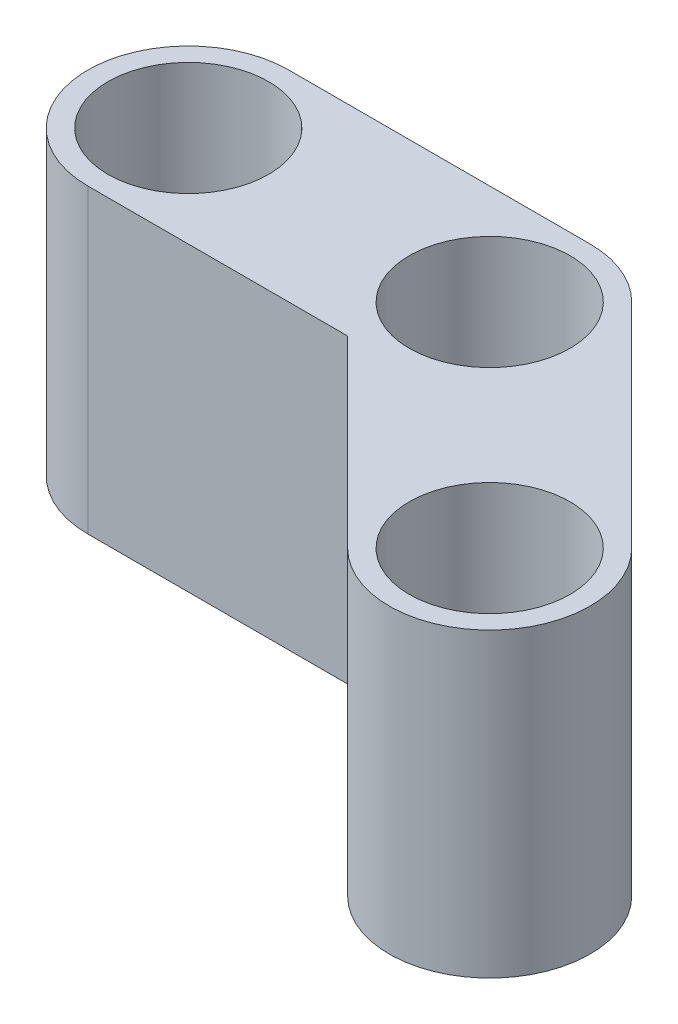
ISO-10303-21;
HEADER;
FILE_DESCRIPTION(('STEP AP214'),'2;1');
FILE_NAME('part.step','',(''),(''),'','','');
FILE_SCHEMA(('AUTOMOTIVE_DESIGN { 1 0 10303 214 1 1 1 1 }'));
ENDSEC;
DATA;
#1=APPLICATION_CONTEXT('core data for automotive mechanical design processes');
#2=APPLICATION_PROTOCOL_DEFINITION('international standard','automotive_design',2000,#1);
#3=PRODUCT_CONTEXT('',#1,'mechanical');
#4=PRODUCT('Part','Part','',(#3));
#5=PRODUCT_RELATED_PRODUCT_CATEGORY('part','',(#4));
#6=PRODUCT_DEFINITION_FORMATION('','',#4);
#7=PRODUCT_DEFINITION_CONTEXT('part definition',#1,'design');
#8=PRODUCT_DEFINITION('design','',#6,#7);
#9=PRODUCT_DEFINITION_SHAPE('','',#8);
#10=(LENGTH_UNIT() NAMED_UNIT(*) SI_UNIT(.MILLI.,.METRE.));
#11=(NAMED_UNIT(*) PLANE_ANGLE_UNIT() SI_UNIT($,.RADIAN.));
#12=(NAMED_UNIT(*) SI_UNIT($,.STERADIAN.) SOLID_ANGLE_UNIT());
#13=UNCERTAINTY_MEASURE_WITH_UNIT(LENGTH_MEASURE(1.E-05),#10,'distance_accuracy_value','');
#14=(GEOMETRIC_REPRESENTATION_CONTEXT(3) GLOBAL_UNCERTAINTY_ASSIGNED_CONTEXT((#13)) GLOBAL_UNIT_ASSIGNED_CONTEXT((#10,
#11,#12)) REPRESENTATION_CONTEXT('',''));
#15=CARTESIAN_POINT('',(0.,0.,0.));
#16=DIRECTION('',(0.,0.,1.));
#17=DIRECTION('',(1.,0.,0.));
#18=AXIS2_PLACEMENT_3D('',#15,#16,#17);
#19=CARTESIAN_POINT('',(7.98940981436062,1.5,-7.98940981436062));
#20=DIRECTION('',(0.707106781186547,0.,-0.707106781186547));
#21=DIRECTION('',(-0.707106781186548,0.,-0.707106781186548));
#22=AXIS2_PLACEMENT_3D('',#19,#20,#21);
#23=PLANE('',#22);
#24=DIRECTION('',(0.707106781186548,0.,0.707106781186548));
#25=VECTOR('',#24,1.);
#26=CARTESIAN_POINT('',(7.98940981436062,0.,-7.98940981436062));
#27=LINE('',#26,#25);
#28=CARTESIAN_POINT('',(-10.7291594542353,0.,-26.7079790829566));
#29=VERTEX_POINT('',#28);
#30=CARTESIAN_POINT('',(-9.6684992824555,0.,-25.6473189111767));
#31=VERTEX_POINT('',#30);
#32=EDGE_CURVE('E147',#29,#31,#27,.T.);
#33=ORIENTED_EDGE('',*,*,#32,.F.);
#34=DIRECTION('',(0.,-1.,0.));
#35=VECTOR('',#34,1.);
#36=CARTESIAN_POINT('',(-10.7291594542353,1.5,-26.7079790829566));
#37=LINE('',#36,#35);
#38=CARTESIAN_POINT('',(-10.7291594542353,1.5,-26.7079790829566));
#39=VERTEX_POINT('',#38);
#40=EDGE_CURVE('E11',#39,#29,#37,.T.);
#41=ORIENTED_EDGE('',*,*,#40,.F.);
#42=DIRECTION('',(0.707106781186548,0.,0.707106781186548));
#43=VECTOR('',#42,1.);
#44=CARTESIAN_POINT('',(7.98940981436062,1.5,-7.98940981436062));
#45=LINE('',#44,#43);
#46=CARTESIAN_POINT('',(-9.6684992824555,1.5,-25.6473189111767));
#47=VERTEX_POINT('',#46);
#48=EDGE_CURVE('E181',#39,#47,#45,.T.);
#49=ORIENTED_EDGE('',*,*,#48,.T.);
#50=DIRECTION('',(0.,-1.,0.));
#51=VECTOR('',#50,1.);
#52=CARTESIAN_POINT('',(-9.6684992824555,1.5,-25.6473189111767));
#53=LINE('',#52,#51);
#54=EDGE_CURVE('E90',#47,#31,#53,.T.);
#55=ORIENTED_EDGE('',*,*,#54,.T.);
#56=EDGE_LOOP('',(#33,#41,#49,#55));
#57=FACE_BOUND('',#56,.T.);
#58=ADVANCED_FACE('F41',(#57),#23,.T.);
#59=CARTESIAN_POINT('',(-11.0827128448286,1.5,-26.3544256923633));
#60=DIRECTION('',(0.,-1.,0.));
#61=DIRECTION('',(0.,0.,-1.));
#62=AXIS2_PLACEMENT_3D('',#59,#60,#61);
#63=CYLINDRICAL_SURFACE('',#62,0.5);
#64=CARTESIAN_POINT('',(-11.0827128448286,0.,-26.3544256923633));
#65=DIRECTION('',(0.,1.,0.));
#66=DIRECTION('',(0.,0.,1.));
#67=AXIS2_PLACEMENT_3D('',#64,#65,#66);
#68=CIRCLE('',#67,0.5);
#69=CARTESIAN_POINT('',(-11.0827128448286,0.,-26.8544256923633));
#70=VERTEX_POINT('',#69);
#71=EDGE_CURVE('E151',#29,#70,#68,.T.);
#72=ORIENTED_EDGE('',*,*,#71,.T.);
#73=DIRECTION('',(0.,-1.,0.));
#74=VECTOR('',#73,1.);
#75=CARTESIAN_POINT('',(-11.0827128448286,1.5,-26.8544256923633));
#76=LINE('',#75,#74);
#77=CARTESIAN_POINT('',(-11.0827128448286,1.5,-26.8544256923633));
#78=VERTEX_POINT('',#77);
#79=EDGE_CURVE('E50',#78,#70,#76,.T.);
#80=ORIENTED_EDGE('',*,*,#79,.F.);
#81=CARTESIAN_POINT('',(-11.0827128448286,1.5,-26.3544256923633));
#82=DIRECTION('',(0.,1.,0.));
#83=DIRECTION('',(0.,0.,1.));
#84=AXIS2_PLACEMENT_3D('',#81,#82,#83);
#85=CIRCLE('',#84,0.5);
#86=EDGE_CURVE('E207',#39,#78,#85,.T.);
#87=ORIENTED_EDGE('',*,*,#86,.F.);
#88=ORIENTED_EDGE('',*,*,#40,.T.);
#89=EDGE_LOOP('',(#72,#80,#87,#88));
#90=FACE_BOUND('',#89,.T.);
#91=ADVANCED_FACE('F199',(#90),#63,.T.);
#92=CARTESIAN_POINT('',(0.,1.5,-26.8544256923633));
#93=DIRECTION('',(0.,0.,-1.));
#94=DIRECTION('',(-1.,0.,0.));
#95=AXIS2_PLACEMENT_3D('',#92,#93,#94);
#96=PLANE('',#95);
#97=DIRECTION('',(1.,0.,0.));
#98=VECTOR('',#97,1.);
#99=CARTESIAN_POINT('',(0.,0.,-26.8544256923633));
#100=LINE('',#99,#98);
#101=CARTESIAN_POINT('',(-12.5827128448286,0.,-26.8544256923633));
#102=VERTEX_POINT('',#101);
#103=EDGE_CURVE('E155',#102,#70,#100,.T.);
#104=ORIENTED_EDGE('',*,*,#103,.F.);
#105=DIRECTION('',(0.,-1.,0.));
#106=VECTOR('',#105,1.);
#107=CARTESIAN_POINT('',(-12.5827128448286,1.5,-26.8544256923633));
#108=LINE('',#107,#106);
#109=CARTESIAN_POINT('',(-12.5827128448286,1.5,-26.8544256923633));
#110=VERTEX_POINT('',#109);
#111=EDGE_CURVE('E188',#110,#102,#108,.T.);
#112=ORIENTED_EDGE('',*,*,#111,.F.);
#113=DIRECTION('',(1.,0.,0.));
#114=VECTOR('',#113,1.);
#115=CARTESIAN_POINT('',(0.,1.5,-26.8544256923633));
#116=LINE('',#115,#114);
#117=EDGE_CURVE('E196',#110,#78,#116,.T.);
#118=ORIENTED_EDGE('',*,*,#117,.T.);
#119=ORIENTED_EDGE('',*,*,#79,.T.);
#120=EDGE_LOOP('',(#104,#112,#118,#119));
#121=FACE_BOUND('',#120,.T.);
#122=ADVANCED_FACE('F195',(#121),#96,.T.);
#123=CARTESIAN_POINT('',(-12.5827128448286,1.5,-26.3544256923633));
#124=DIRECTION('',(0.,-1.,0.));
#125=DIRECTION('',(0.,0.,-1.));
#126=AXIS2_PLACEMENT_3D('',#123,#124,#125);
#127=CYLINDRICAL_SURFACE('',#126,0.5);
#128=CARTESIAN_POINT('',(-12.5827128448286,0.,-26.3544256923633));
#129=DIRECTION('',(0.,1.,0.));
#130=DIRECTION('',(0.,0.,1.));
#131=AXIS2_PLACEMENT_3D('',#128,#129,#130);
#132=CIRCLE('',#131,0.5);
#133=CARTESIAN_POINT('',(-12.5827128448286,0.,-25.8544256923633));
#134=VERTEX_POINT('',#133);
#135=EDGE_CURVE('E159',#102,#134,#132,.T.);
#136=ORIENTED_EDGE('',*,*,#135,.T.);
#137=DIRECTION('',(0.,-1.,0.));
#138=VECTOR('',#137,1.);
#139=CARTESIAN_POINT('',(-12.5827128448286,1.5,-25.8544256923633));
#140=LINE('',#139,#138);
#141=CARTESIAN_POINT('',(-12.5827128448286,1.5,-25.8544256923633));
#142=VERTEX_POINT('',#141);
#143=EDGE_CURVE('E125',#142,#134,#140,.T.);
#144=ORIENTED_EDGE('',*,*,#143,.F.);
#145=CARTESIAN_POINT('',(-12.5827128448286,1.5,-26.3544256923633));
#146=DIRECTION('',(0.,1.,0.));
#147=DIRECTION('',(0.,0.,1.));
#148=AXIS2_PLACEMENT_3D('',#145,#146,#147);
#149=CIRCLE('',#148,0.5);
#150=EDGE_CURVE('E114',#110,#142,#149,.T.);
#151=ORIENTED_EDGE('',*,*,#150,.F.);
#152=ORIENTED_EDGE('',*,*,#111,.T.);
#153=EDGE_LOOP('',(#136,#144,#151,#152));
#154=FACE_BOUND('',#153,.T.);
#155=ADVANCED_FACE('F205',(#154),#127,.T.);
#156=CARTESIAN_POINT('',(0.,1.5,-25.8544256923633));
#157=DIRECTION('',(0.,0.,-1.));
#158=DIRECTION('',(-1.,0.,0.));
#159=AXIS2_PLACEMENT_3D('',#156,#157,#158);
#160=PLANE('',#159);
#161=DIRECTION('',(1.,0.,0.));
#162=VECTOR('',#161,1.);
#163=CARTESIAN_POINT('',(0.,0.,-25.8544256923633));
#164=LINE('',#163,#162);
#165=CARTESIAN_POINT('',(-11.2898196260151,0.,-25.8544256923633));
#166=VERTEX_POINT('',#165);
#167=EDGE_CURVE('E123',#134,#166,#164,.T.);
#168=ORIENTED_EDGE('',*,*,#167,.T.);
#169=DIRECTION('',(0.,-1.,0.));
#170=VECTOR('',#169,1.);
#171=CARTESIAN_POINT('',(-11.2898196260151,1.5,-25.8544256923633));
#172=LINE('',#171,#170);
#173=CARTESIAN_POINT('',(-11.2898196260151,1.5,-25.8544256923633));
#174=VERTEX_POINT('',#173);
#175=EDGE_CURVE('E120',#174,#166,#172,.T.);
#176=ORIENTED_EDGE('',*,*,#175,.F.);
#177=DIRECTION('',(1.,0.,0.));
#178=VECTOR('',#177,1.);
#179=CARTESIAN_POINT('',(0.,1.5,-25.8544256923633));
#180=LINE('',#179,#178);
#181=EDGE_CURVE('E106',#142,#174,#180,.T.);
#182=ORIENTED_EDGE('',*,*,#181,.F.);
#183=ORIENTED_EDGE('',*,*,#143,.T.);
#184=EDGE_LOOP('',(#168,#176,#182,#183));
#185=FACE_BOUND('',#184,.T.);
#186=ADVANCED_FACE('F121',(#185),#160,.F.);
#187=CARTESIAN_POINT('',(7.28230303317408,1.5,-7.28230303317408));
#188=DIRECTION('',(0.707106781186547,0.,-0.707106781186547));
#189=DIRECTION('',(-0.707106781186548,0.,-0.707106781186548));
#190=AXIS2_PLACEMENT_3D('',#187,#188,#189);
#191=PLANE('',#190);
#192=DIRECTION('',(0.707106781186548,0.,0.707106781186548));
#193=VECTOR('',#192,1.);
#194=CARTESIAN_POINT('',(7.28230303317408,0.,-7.28230303317408));
#195=LINE('',#194,#193);
#196=CARTESIAN_POINT('',(-10.375606063642,0.,-24.9402121299902));
#197=VERTEX_POINT('',#196);
#198=EDGE_CURVE('E83',#166,#197,#195,.T.);
#199=ORIENTED_EDGE('',*,*,#198,.T.);
#200=DIRECTION('',(0.,-1.,0.));
#201=VECTOR('',#200,1.);
#202=CARTESIAN_POINT('',(-10.375606063642,1.5,-24.9402121299902));
#203=LINE('',#202,#201);
#204=CARTESIAN_POINT('',(-10.375606063642,1.5,-24.9402121299902));
#205=VERTEX_POINT('',#204);
#206=EDGE_CURVE('E126',#205,#197,#203,.T.);
#207=ORIENTED_EDGE('',*,*,#206,.F.);
#208=DIRECTION('',(0.707106781186548,0.,0.707106781186548));
#209=VECTOR('',#208,1.);
#210=CARTESIAN_POINT('',(7.28230303317408,1.5,-7.28230303317408));
#211=LINE('',#210,#209);
#212=EDGE_CURVE('E111',#174,#205,#211,.T.);
#213=ORIENTED_EDGE('',*,*,#212,.F.);
#214=ORIENTED_EDGE('',*,*,#175,.T.);
#215=EDGE_LOOP('',(#199,#207,#213,#214));
#216=FACE_BOUND('',#215,.T.);
#217=ADVANCED_FACE('F128',(#216),#191,.F.);
#218=CARTESIAN_POINT('',(-10.0220526730488,1.5,-25.2937655205835));
#219=DIRECTION('',(0.,-1.,0.));
#220=DIRECTION('',(0.,0.,-1.));
#221=AXIS2_PLACEMENT_3D('',#218,#219,#220);
#222=CYLINDRICAL_SURFACE('',#221,0.400000000000003);
#223=CARTESIAN_POINT('',(-10.0220526730488,1.5,-25.2937655205835));
#224=DIRECTION('',(0.,1.,0.));
#225=DIRECTION('',(0.,0.,1.));
#226=AXIS2_PLACEMENT_3D('',#223,#224,#225);
#227=CIRCLE('',#226,0.400000000000003);
#228=CARTESIAN_POINT('',(-10.0220526730488,1.5,-24.8937655205835));
#229=VERTEX_POINT('',#228);
#230=EDGE_CURVE('E139',#229,#229,#227,.T.);
#231=ORIENTED_EDGE('',*,*,#230,.T.);
#232=EDGE_LOOP('',(#231));
#233=FACE_BOUND('',#232,.T.);
#234=CARTESIAN_POINT('',(-10.0220526730488,0.,-25.2937655205835));
#235=DIRECTION('',(0.,1.,0.));
#236=DIRECTION('',(0.,0.,1.));
#237=AXIS2_PLACEMENT_3D('',#234,#235,#236);
#238=CIRCLE('',#237,0.400000000000003);
#239=CARTESIAN_POINT('',(-10.0220526730488,0.,-24.8937655205835));
#240=VERTEX_POINT('',#239);
#241=EDGE_CURVE('E173',#240,#240,#238,.T.);
#242=ORIENTED_EDGE('',*,*,#241,.F.);
#243=EDGE_LOOP('',(#242));
#244=FACE_BOUND('',#243,.T.);
#245=ADVANCED_FACE('F229',(#233,#244),#222,.F.);
#246=CARTESIAN_POINT('',(-11.0827128448286,1.5,-26.3544256923633));
#247=DIRECTION('',(0.,-1.,0.));
#248=DIRECTION('',(0.,0.,-1.));
#249=AXIS2_PLACEMENT_3D('',#246,#247,#248);
#250=CYLINDRICAL_SURFACE('',#249,0.4);
#251=CARTESIAN_POINT('',(-11.0827128448286,1.5,-26.3544256923633));
#252=DIRECTION('',(0.,1.,0.));
#253=DIRECTION('',(0.,0.,1.));
#254=AXIS2_PLACEMENT_3D('',#251,#252,#253);
#255=CIRCLE('',#254,0.4);
#256=CARTESIAN_POINT('',(-11.0827128448286,1.5,-25.9544256923633));
#257=VERTEX_POINT('',#256);
#258=EDGE_CURVE('E132',#257,#257,#255,.T.);
#259=ORIENTED_EDGE('',*,*,#258,.T.);
#260=EDGE_LOOP('',(#259));
#261=FACE_BOUND('',#260,.T.);
#262=CARTESIAN_POINT('',(-11.0827128448286,0.,-26.3544256923633));
#263=DIRECTION('',(0.,1.,0.));
#264=DIRECTION('',(0.,0.,1.));
#265=AXIS2_PLACEMENT_3D('',#262,#263,#264);
#266=CIRCLE('',#265,0.4);
#267=CARTESIAN_POINT('',(-11.0827128448286,0.,-25.9544256923633));
#268=VERTEX_POINT('',#267);
#269=EDGE_CURVE('E169',#268,#268,#266,.T.);
#270=ORIENTED_EDGE('',*,*,#269,.F.);
#271=EDGE_LOOP('',(#270));
#272=FACE_BOUND('',#271,.T.);
#273=ADVANCED_FACE('F234',(#261,#272),#250,.F.);
#274=CARTESIAN_POINT('',(-10.0220526730488,1.5,-25.2937655205835));
#275=DIRECTION('',(0.,-1.,0.));
#276=DIRECTION('',(0.,0.,-1.));
#277=AXIS2_PLACEMENT_3D('',#274,#275,#276);
#278=CYLINDRICAL_SURFACE('',#277,0.499999999999996);
#279=CARTESIAN_POINT('',(-10.0220526730488,0.,-25.2937655205835));
#280=DIRECTION('',(0.,1.,0.));
#281=DIRECTION('',(0.,0.,1.));
#282=AXIS2_PLACEMENT_3D('',#279,#280,#281);
#283=CIRCLE('',#282,0.499999999999996);
#284=EDGE_CURVE('E166',#197,#31,#283,.T.);
#285=ORIENTED_EDGE('',*,*,#284,.T.);
#286=ORIENTED_EDGE('',*,*,#54,.F.);
#287=CARTESIAN_POINT('',(-10.0220526730488,1.5,-25.2937655205835));
#288=DIRECTION('',(0.,1.,0.));
#289=DIRECTION('',(0.,0.,1.));
#290=AXIS2_PLACEMENT_3D('',#287,#288,#289);
#291=CIRCLE('',#290,0.499999999999996);
#292=EDGE_CURVE('E58',#205,#47,#291,.T.);
#293=ORIENTED_EDGE('',*,*,#292,.F.);
#294=ORIENTED_EDGE('',*,*,#206,.T.);
#295=EDGE_LOOP('',(#285,#286,#293,#294));
#296=FACE_BOUND('',#295,.T.);
#297=ADVANCED_FACE('F230',(#296),#278,.T.);
#298=CARTESIAN_POINT('',(-12.5827128448286,1.5,-26.3544256923633));
#299=DIRECTION('',(0.,-1.,0.));
#300=DIRECTION('',(0.,0.,-1.));
#301=AXIS2_PLACEMENT_3D('',#298,#299,#300);
#302=CYLINDRICAL_SURFACE('',#301,0.4);
#303=CARTESIAN_POINT('',(-12.5827128448286,1.5,-26.3544256923633));
#304=DIRECTION('',(0.,1.,0.));
#305=DIRECTION('',(0.,0.,1.));
#306=AXIS2_PLACEMENT_3D('',#303,#304,#305);
#307=CIRCLE('',#306,0.4);
#308=CARTESIAN_POINT('',(-12.5827128448286,1.5,-25.9544256923633));
#309=VERTEX_POINT('',#308);
#310=EDGE_CURVE('E143',#309,#309,#307,.T.);
#311=ORIENTED_EDGE('',*,*,#310,.T.);
#312=EDGE_LOOP('',(#311));
#313=FACE_BOUND('',#312,.T.);
#314=CARTESIAN_POINT('',(-12.5827128448286,0.,-26.3544256923633));
#315=DIRECTION('',(0.,1.,0.));
#316=DIRECTION('',(0.,0.,1.));
#317=AXIS2_PLACEMENT_3D('',#314,#315,#316);
#318=CIRCLE('',#317,0.4);
#319=CARTESIAN_POINT('',(-12.5827128448286,0.,-25.9544256923633));
#320=VERTEX_POINT('',#319);
#321=EDGE_CURVE('E177',#320,#320,#318,.T.);
#322=ORIENTED_EDGE('',*,*,#321,.F.);
#323=EDGE_LOOP('',(#322));
#324=FACE_BOUND('',#323,.T.);
#325=ADVANCED_FACE('F233',(#313,#324),#302,.F.);
#326=CARTESIAN_POINT('',(0.,1.5,0.));
#327=DIRECTION('',(0.,1.,0.));
#328=DIRECTION('',(0.,0.,1.));
#329=AXIS2_PLACEMENT_3D('',#326,#327,#328);
#330=PLANE('',#329);
#331=ORIENTED_EDGE('',*,*,#48,.F.);
#332=ORIENTED_EDGE('',*,*,#86,.T.);
#333=ORIENTED_EDGE('',*,*,#117,.F.);
#334=ORIENTED_EDGE('',*,*,#150,.T.);
#335=ORIENTED_EDGE('',*,*,#181,.T.);
#336=ORIENTED_EDGE('',*,*,#212,.T.);
#337=ORIENTED_EDGE('',*,*,#292,.T.);
#338=EDGE_LOOP('',(#331,#332,#333,#334,#335,#336,#337));
#339=FACE_BOUND('',#338,.T.);
#340=ORIENTED_EDGE('',*,*,#258,.F.);
#341=EDGE_LOOP('',(#340));
#342=FACE_BOUND('',#341,.T.);
#343=ORIENTED_EDGE('',*,*,#230,.F.);
#344=EDGE_LOOP('',(#343));
#345=FACE_BOUND('',#344,.T.);
#346=ORIENTED_EDGE('',*,*,#310,.F.);
#347=EDGE_LOOP('',(#346));
#348=FACE_BOUND('',#347,.T.);
#349=ADVANCED_FACE('F108',(#339,#342,#345,#348),#330,.T.);
#350=CARTESIAN_POINT('',(0.,0.,0.));
#351=DIRECTION('',(0.,1.,0.));
#352=DIRECTION('',(0.,0.,1.));
#353=AXIS2_PLACEMENT_3D('',#350,#351,#352);
#354=PLANE('',#353);
#355=ORIENTED_EDGE('',*,*,#32,.T.);
#356=ORIENTED_EDGE('',*,*,#284,.F.);
#357=ORIENTED_EDGE('',*,*,#198,.F.);
#358=ORIENTED_EDGE('',*,*,#167,.F.);
#359=ORIENTED_EDGE('',*,*,#135,.F.);
#360=ORIENTED_EDGE('',*,*,#103,.T.);
#361=ORIENTED_EDGE('',*,*,#71,.F.);
#362=EDGE_LOOP('',(#355,#356,#357,#358,#359,#360,#361));
#363=FACE_BOUND('',#362,.T.);
#364=ORIENTED_EDGE('',*,*,#269,.T.);
#365=EDGE_LOOP('',(#364));
#366=FACE_BOUND('',#365,.T.);
#367=ORIENTED_EDGE('',*,*,#241,.T.);
#368=EDGE_LOOP('',(#367));
#369=FACE_BOUND('',#368,.T.);
#370=ORIENTED_EDGE('',*,*,#321,.T.);
#371=EDGE_LOOP('',(#370));
#372=FACE_BOUND('',#371,.T.);
#373=ADVANCED_FACE('F202',(#363,#366,#369,#372),#354,.F.);
#374=CLOSED_SHELL('',(#58,#91,#122,#155,#186,#217,#245,#273,#297,#325,#349,#373));
#375=MANIFOLD_SOLID_BREP('B2',#374);
#376=ADVANCED_BREP_SHAPE_REPRESENTATION('',(#18,#375),#14);
#377=SHAPE_DEFINITION_REPRESENTATION(#9,#376);
ENDSEC;
END-ISO-10303-21;
